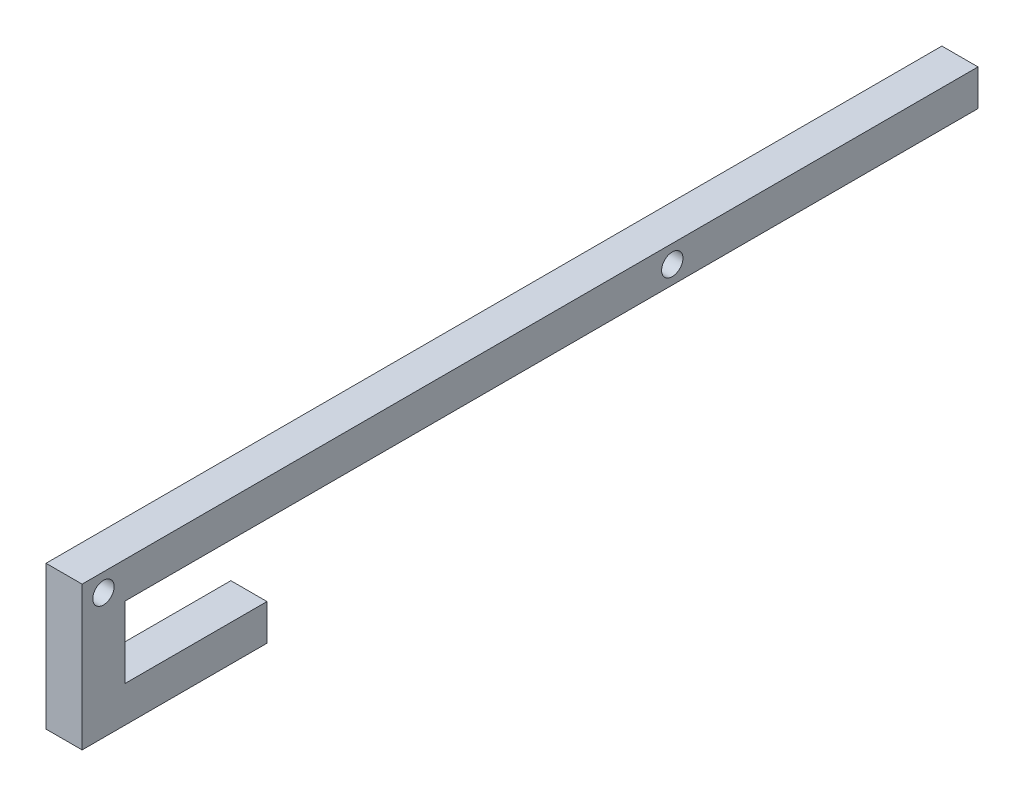
ISO-10303-21;
HEADER;
FILE_DESCRIPTION(('STEP AP214'),'2;1');
FILE_NAME('part.step','',(''),(''),'','','');
FILE_SCHEMA(('AUTOMOTIVE_DESIGN { 1 0 10303 214 1 1 1 1 }'));
ENDSEC;
DATA;
#1=APPLICATION_CONTEXT('core data for automotive mechanical design processes');
#2=APPLICATION_PROTOCOL_DEFINITION('international standard','automotive_design',2000,#1);
#3=PRODUCT_CONTEXT('',#1,'mechanical');
#4=PRODUCT('Part','Part','',(#3));
#5=PRODUCT_RELATED_PRODUCT_CATEGORY('part','',(#4));
#6=PRODUCT_DEFINITION_FORMATION('','',#4);
#7=PRODUCT_DEFINITION_CONTEXT('part definition',#1,'design');
#8=PRODUCT_DEFINITION('design','',#6,#7);
#9=PRODUCT_DEFINITION_SHAPE('','',#8);
#10=(LENGTH_UNIT() NAMED_UNIT(*) SI_UNIT(.MILLI.,.METRE.));
#11=(NAMED_UNIT(*) PLANE_ANGLE_UNIT() SI_UNIT($,.RADIAN.));
#12=(NAMED_UNIT(*) SI_UNIT($,.STERADIAN.) SOLID_ANGLE_UNIT());
#13=UNCERTAINTY_MEASURE_WITH_UNIT(LENGTH_MEASURE(1.E-05),#10,'distance_accuracy_value','');
#14=(GEOMETRIC_REPRESENTATION_CONTEXT(3) GLOBAL_UNCERTAINTY_ASSIGNED_CONTEXT((#13)) GLOBAL_UNIT_ASSIGNED_CONTEXT((#10,
#11,#12)) REPRESENTATION_CONTEXT('',''));
#15=CARTESIAN_POINT('',(0.,0.,0.));
#16=DIRECTION('',(0.,0.,1.));
#17=DIRECTION('',(1.,0.,0.));
#18=AXIS2_PLACEMENT_3D('',#15,#16,#17);
#19=CARTESIAN_POINT('',(12.7,0.,0.));
#20=DIRECTION('',(0.,1.,0.));
#21=DIRECTION('',(0.,0.,1.));
#22=AXIS2_PLACEMENT_3D('',#19,#20,#21);
#23=PLANE('',#22);
#24=DIRECTION('',(0.,0.,-1.));
#25=VECTOR('',#24,1.);
#26=CARTESIAN_POINT('',(0.,0.,0.));
#27=LINE('',#26,#25);
#28=CARTESIAN_POINT('',(0.,0.,-15.));
#29=VERTEX_POINT('',#28);
#30=CARTESIAN_POINT('',(0.,0.,-315.));
#31=VERTEX_POINT('',#30);
#32=EDGE_CURVE('E144',#29,#31,#27,.T.);
#33=ORIENTED_EDGE('',*,*,#32,.T.);
#34=DIRECTION('',(-1.,0.,0.));
#35=VECTOR('',#34,1.);
#36=CARTESIAN_POINT('',(12.7,0.,-315.));
#37=LINE('',#36,#35);
#38=CARTESIAN_POINT('',(12.7,0.,-315.));
#39=VERTEX_POINT('',#38);
#40=EDGE_CURVE('E11',#39,#31,#37,.T.);
#41=ORIENTED_EDGE('',*,*,#40,.F.);
#42=DIRECTION('',(0.,0.,-1.));
#43=VECTOR('',#42,1.);
#44=CARTESIAN_POINT('',(12.7,0.,0.));
#45=LINE('',#44,#43);
#46=CARTESIAN_POINT('',(12.7,0.,-15.));
#47=VERTEX_POINT('',#46);
#48=EDGE_CURVE('E172',#47,#39,#45,.T.);
#49=ORIENTED_EDGE('',*,*,#48,.F.);
#50=DIRECTION('',(-1.,0.,0.));
#51=VECTOR('',#50,1.);
#52=CARTESIAN_POINT('',(12.7,0.,-15.));
#53=LINE('',#52,#51);
#54=EDGE_CURVE('E58',#47,#29,#53,.T.);
#55=ORIENTED_EDGE('',*,*,#54,.T.);
#56=EDGE_LOOP('',(#33,#41,#49,#55));
#57=FACE_BOUND('',#56,.T.);
#58=ADVANCED_FACE('F41',(#57),#23,.F.);
#59=CARTESIAN_POINT('',(12.7,0.,-315.));
#60=DIRECTION('',(0.,0.,1.));
#61=DIRECTION('',(1.,0.,0.));
#62=AXIS2_PLACEMENT_3D('',#59,#60,#61);
#63=PLANE('',#62);
#64=DIRECTION('',(0.,1.,0.));
#65=VECTOR('',#64,1.);
#66=CARTESIAN_POINT('',(0.,0.,-315.));
#67=LINE('',#66,#65);
#68=CARTESIAN_POINT('',(0.,12.7000000000001,-315.));
#69=VERTEX_POINT('',#68);
#70=EDGE_CURVE('E147',#31,#69,#67,.T.);
#71=ORIENTED_EDGE('',*,*,#70,.T.);
#72=DIRECTION('',(-1.,0.,0.));
#73=VECTOR('',#72,1.);
#74=CARTESIAN_POINT('',(12.7,12.7000000000001,-315.));
#75=LINE('',#74,#73);
#76=CARTESIAN_POINT('',(12.7,12.7000000000001,-315.));
#77=VERTEX_POINT('',#76);
#78=EDGE_CURVE('E50',#77,#69,#75,.T.);
#79=ORIENTED_EDGE('',*,*,#78,.F.);
#80=DIRECTION('',(0.,1.,0.));
#81=VECTOR('',#80,1.);
#82=CARTESIAN_POINT('',(12.7,0.,-315.));
#83=LINE('',#82,#81);
#84=EDGE_CURVE('E96',#39,#77,#83,.T.);
#85=ORIENTED_EDGE('',*,*,#84,.F.);
#86=ORIENTED_EDGE('',*,*,#40,.T.);
#87=EDGE_LOOP('',(#71,#79,#85,#86));
#88=FACE_BOUND('',#87,.T.);
#89=ADVANCED_FACE('F191',(#88),#63,.F.);
#90=CARTESIAN_POINT('',(12.7,12.7,0.));
#91=DIRECTION('',(0.,1.,0.));
#92=DIRECTION('',(0.,0.,1.));
#93=AXIS2_PLACEMENT_3D('',#90,#91,#92);
#94=PLANE('',#93);
#95=DIRECTION('',(0.,0.,-1.));
#96=VECTOR('',#95,1.);
#97=CARTESIAN_POINT('',(0.,12.7,0.));
#98=LINE('',#97,#96);
#99=CARTESIAN_POINT('',(0.,12.7,0.));
#100=VERTEX_POINT('',#99);
#101=EDGE_CURVE('E152',#100,#69,#98,.T.);
#102=ORIENTED_EDGE('',*,*,#101,.F.);
#103=DIRECTION('',(-1.,0.,0.));
#104=VECTOR('',#103,1.);
#105=CARTESIAN_POINT('',(12.7,12.7,0.));
#106=LINE('',#105,#104);
#107=CARTESIAN_POINT('',(12.7,12.7,0.));
#108=VERTEX_POINT('',#107);
#109=EDGE_CURVE('E182',#108,#100,#106,.T.);
#110=ORIENTED_EDGE('',*,*,#109,.F.);
#111=DIRECTION('',(0.,0.,-1.));
#112=VECTOR('',#111,1.);
#113=CARTESIAN_POINT('',(12.7,12.7,0.));
#114=LINE('',#113,#112);
#115=EDGE_CURVE('E190',#108,#77,#114,.T.);
#116=ORIENTED_EDGE('',*,*,#115,.T.);
#117=ORIENTED_EDGE('',*,*,#78,.T.);
#118=EDGE_LOOP('',(#102,#110,#116,#117));
#119=FACE_BOUND('',#118,.T.);
#120=ADVANCED_FACE('F188',(#119),#94,.T.);
#121=CARTESIAN_POINT('',(12.7,0.,0.));
#122=DIRECTION('',(0.,0.,1.));
#123=DIRECTION('',(1.,0.,0.));
#124=AXIS2_PLACEMENT_3D('',#121,#122,#123);
#125=PLANE('',#124);
#126=DIRECTION('',(0.,1.,0.));
#127=VECTOR('',#126,1.);
#128=CARTESIAN_POINT('',(0.,0.,0.));
#129=LINE('',#128,#127);
#130=CARTESIAN_POINT('',(0.,-37.8,0.));
#131=VERTEX_POINT('',#130);
#132=EDGE_CURVE('E156',#131,#100,#129,.T.);
#133=ORIENTED_EDGE('',*,*,#132,.F.);
#134=DIRECTION('',(-1.,0.,0.));
#135=VECTOR('',#134,1.);
#136=CARTESIAN_POINT('',(12.7,-37.8,0.));
#137=LINE('',#136,#135);
#138=CARTESIAN_POINT('',(12.7,-37.8,0.));
#139=VERTEX_POINT('',#138);
#140=EDGE_CURVE('E179',#139,#131,#137,.T.);
#141=ORIENTED_EDGE('',*,*,#140,.F.);
#142=DIRECTION('',(0.,1.,0.));
#143=VECTOR('',#142,1.);
#144=CARTESIAN_POINT('',(12.7,0.,0.));
#145=LINE('',#144,#143);
#146=EDGE_CURVE('E200',#139,#108,#145,.T.);
#147=ORIENTED_EDGE('',*,*,#146,.T.);
#148=ORIENTED_EDGE('',*,*,#109,.T.);
#149=EDGE_LOOP('',(#133,#141,#147,#148));
#150=FACE_BOUND('',#149,.T.);
#151=ADVANCED_FACE('F198',(#150),#125,.T.);
#152=CARTESIAN_POINT('',(12.7,-37.8,0.));
#153=DIRECTION('',(0.,1.,0.));
#154=DIRECTION('',(0.,0.,1.));
#155=AXIS2_PLACEMENT_3D('',#152,#153,#154);
#156=PLANE('',#155);
#157=DIRECTION('',(0.,0.,-1.));
#158=VECTOR('',#157,1.);
#159=CARTESIAN_POINT('',(0.,-37.8,0.));
#160=LINE('',#159,#158);
#161=CARTESIAN_POINT('',(0.,-37.8,-65.));
#162=VERTEX_POINT('',#161);
#163=EDGE_CURVE('E160',#131,#162,#160,.T.);
#164=ORIENTED_EDGE('',*,*,#163,.T.);
#165=DIRECTION('',(-1.,0.,0.));
#166=VECTOR('',#165,1.);
#167=CARTESIAN_POINT('',(12.7,-37.8,-65.));
#168=LINE('',#167,#166);
#169=CARTESIAN_POINT('',(12.7,-37.8,-65.));
#170=VERTEX_POINT('',#169);
#171=EDGE_CURVE('E134',#170,#162,#168,.T.);
#172=ORIENTED_EDGE('',*,*,#171,.F.);
#173=DIRECTION('',(0.,0.,-1.));
#174=VECTOR('',#173,1.);
#175=CARTESIAN_POINT('',(12.7,-37.8,0.));
#176=LINE('',#175,#174);
#177=EDGE_CURVE('E120',#139,#170,#176,.T.);
#178=ORIENTED_EDGE('',*,*,#177,.F.);
#179=ORIENTED_EDGE('',*,*,#140,.T.);
#180=EDGE_LOOP('',(#164,#172,#178,#179));
#181=FACE_BOUND('',#180,.T.);
#182=ADVANCED_FACE('F263',(#181),#156,.F.);
#183=CARTESIAN_POINT('',(12.7,0.,-65.));
#184=DIRECTION('',(0.,0.,1.));
#185=DIRECTION('',(1.,0.,0.));
#186=AXIS2_PLACEMENT_3D('',#183,#184,#185);
#187=PLANE('',#186);
#188=DIRECTION('',(0.,1.,0.));
#189=VECTOR('',#188,1.);
#190=CARTESIAN_POINT('',(0.,0.,-65.));
#191=LINE('',#190,#189);
#192=CARTESIAN_POINT('',(0.,-25.1,-65.));
#193=VERTEX_POINT('',#192);
#194=EDGE_CURVE('E130',#162,#193,#191,.T.);
#195=ORIENTED_EDGE('',*,*,#194,.T.);
#196=DIRECTION('',(-1.,0.,0.));
#197=VECTOR('',#196,1.);
#198=CARTESIAN_POINT('',(12.7,-25.1,-65.));
#199=LINE('',#198,#197);
#200=CARTESIAN_POINT('',(12.7,-25.1,-65.));
#201=VERTEX_POINT('',#200);
#202=EDGE_CURVE('E127',#201,#193,#199,.T.);
#203=ORIENTED_EDGE('',*,*,#202,.F.);
#204=DIRECTION('',(0.,1.,0.));
#205=VECTOR('',#204,1.);
#206=CARTESIAN_POINT('',(12.7,0.,-65.));
#207=LINE('',#206,#205);
#208=EDGE_CURVE('E112',#170,#201,#207,.T.);
#209=ORIENTED_EDGE('',*,*,#208,.F.);
#210=ORIENTED_EDGE('',*,*,#171,.T.);
#211=EDGE_LOOP('',(#195,#203,#209,#210));
#212=FACE_BOUND('',#211,.T.);
#213=ADVANCED_FACE('F128',(#212),#187,.F.);
#214=CARTESIAN_POINT('',(12.7,-25.1,0.));
#215=DIRECTION('',(0.,1.,0.));
#216=DIRECTION('',(0.,0.,1.));
#217=AXIS2_PLACEMENT_3D('',#214,#215,#216);
#218=PLANE('',#217);
#219=DIRECTION('',(0.,0.,-1.));
#220=VECTOR('',#219,1.);
#221=CARTESIAN_POINT('',(0.,-25.1,0.));
#222=LINE('',#221,#220);
#223=CARTESIAN_POINT('',(0.,-25.1,-15.));
#224=VERTEX_POINT('',#223);
#225=EDGE_CURVE('E165',#224,#193,#222,.T.);
#226=ORIENTED_EDGE('',*,*,#225,.F.);
#227=DIRECTION('',(-1.,0.,0.));
#228=VECTOR('',#227,1.);
#229=CARTESIAN_POINT('',(12.7,-25.1,-15.));
#230=LINE('',#229,#228);
#231=CARTESIAN_POINT('',(12.7,-25.1,-15.));
#232=VERTEX_POINT('',#231);
#233=EDGE_CURVE('E84',#232,#224,#230,.T.);
#234=ORIENTED_EDGE('',*,*,#233,.F.);
#235=DIRECTION('',(0.,0.,-1.));
#236=VECTOR('',#235,1.);
#237=CARTESIAN_POINT('',(12.7,-25.1,0.));
#238=LINE('',#237,#236);
#239=EDGE_CURVE('E117',#232,#201,#238,.T.);
#240=ORIENTED_EDGE('',*,*,#239,.T.);
#241=ORIENTED_EDGE('',*,*,#202,.T.);
#242=EDGE_LOOP('',(#226,#234,#240,#241));
#243=FACE_BOUND('',#242,.T.);
#244=ADVANCED_FACE('F136',(#243),#218,.T.);
#245=CARTESIAN_POINT('',(12.7,0.,-15.));
#246=DIRECTION('',(0.,0.,-1.));
#247=DIRECTION('',(0.,1.,0.));
#248=AXIS2_PLACEMENT_3D('',#245,#246,#247);
#249=PLANE('',#248);
#250=DIRECTION('',(0.,-1.,0.));
#251=VECTOR('',#250,1.);
#252=CARTESIAN_POINT('',(0.,0.,-15.));
#253=LINE('',#252,#251);
#254=EDGE_CURVE('E168',#29,#224,#253,.T.);
#255=ORIENTED_EDGE('',*,*,#254,.F.);
#256=ORIENTED_EDGE('',*,*,#54,.F.);
#257=DIRECTION('',(0.,-1.,0.));
#258=VECTOR('',#257,1.);
#259=CARTESIAN_POINT('',(12.7,0.,-15.));
#260=LINE('',#259,#258);
#261=EDGE_CURVE('E138',#47,#232,#260,.T.);
#262=ORIENTED_EDGE('',*,*,#261,.T.);
#263=ORIENTED_EDGE('',*,*,#233,.T.);
#264=EDGE_LOOP('',(#255,#256,#262,#263));
#265=FACE_BOUND('',#264,.T.);
#266=ADVANCED_FACE('F238',(#265),#249,.T.);
#267=CARTESIAN_POINT('',(12.7,0.,0.));
#268=DIRECTION('',(1.,0.,0.));
#269=DIRECTION('',(0.,0.,-1.));
#270=AXIS2_PLACEMENT_3D('',#267,#268,#269);
#271=PLANE('',#270);
#272=CARTESIAN_POINT('',(12.7,6.35,-7.5));
#273=DIRECTION('',(1.,0.,0.));
#274=DIRECTION('',(0.,0.,-1.));
#275=AXIS2_PLACEMENT_3D('',#272,#273,#274);
#276=CIRCLE('',#275,3.75);
#277=CARTESIAN_POINT('',(12.7,6.35,-11.25));
#278=VERTEX_POINT('',#277);
#279=EDGE_CURVE('E219',#278,#278,#276,.T.);
#280=ORIENTED_EDGE('',*,*,#279,.F.);
#281=EDGE_LOOP('',(#280));
#282=FACE_BOUND('',#281,.T.);
#283=CARTESIAN_POINT('',(12.7,6.35,-207.5));
#284=DIRECTION('',(1.,0.,0.));
#285=DIRECTION('',(0.,0.,-1.));
#286=AXIS2_PLACEMENT_3D('',#283,#284,#285);
#287=CIRCLE('',#286,3.75000000000001);
#288=CARTESIAN_POINT('',(12.7,6.35,-211.25));
#289=VERTEX_POINT('',#288);
#290=EDGE_CURVE('E211',#289,#289,#287,.T.);
#291=ORIENTED_EDGE('',*,*,#290,.F.);
#292=EDGE_LOOP('',(#291));
#293=FACE_BOUND('',#292,.T.);
#294=ORIENTED_EDGE('',*,*,#48,.T.);
#295=ORIENTED_EDGE('',*,*,#84,.T.);
#296=ORIENTED_EDGE('',*,*,#115,.F.);
#297=ORIENTED_EDGE('',*,*,#146,.F.);
#298=ORIENTED_EDGE('',*,*,#177,.T.);
#299=ORIENTED_EDGE('',*,*,#208,.T.);
#300=ORIENTED_EDGE('',*,*,#239,.F.);
#301=ORIENTED_EDGE('',*,*,#261,.F.);
#302=EDGE_LOOP('',(#294,#295,#296,#297,#298,#299,#300,#301));
#303=FACE_BOUND('',#302,.T.);
#304=ADVANCED_FACE('F114',(#282,#293,#303),#271,.T.);
#305=CARTESIAN_POINT('',(0.,0.,0.));
#306=DIRECTION('',(1.,0.,0.));
#307=DIRECTION('',(0.,0.,-1.));
#308=AXIS2_PLACEMENT_3D('',#305,#306,#307);
#309=PLANE('',#308);
#310=CARTESIAN_POINT('',(0.,6.35,-7.5));
#311=DIRECTION('',(1.,0.,0.));
#312=DIRECTION('',(0.,0.,-1.));
#313=AXIS2_PLACEMENT_3D('',#310,#311,#312);
#314=CIRCLE('',#313,3.75);
#315=CARTESIAN_POINT('',(0.,6.35,-11.25));
#316=VERTEX_POINT('',#315);
#317=EDGE_CURVE('E148',#316,#316,#314,.T.);
#318=ORIENTED_EDGE('',*,*,#317,.T.);
#319=EDGE_LOOP('',(#318));
#320=FACE_BOUND('',#319,.T.);
#321=CARTESIAN_POINT('',(0.,6.35,-207.5));
#322=DIRECTION('',(1.,0.,0.));
#323=DIRECTION('',(0.,0.,-1.));
#324=AXIS2_PLACEMENT_3D('',#321,#322,#323);
#325=CIRCLE('',#324,3.75000000000001);
#326=CARTESIAN_POINT('',(0.,6.35,-211.25));
#327=VERTEX_POINT('',#326);
#328=EDGE_CURVE('E215',#327,#327,#325,.T.);
#329=ORIENTED_EDGE('',*,*,#328,.T.);
#330=EDGE_LOOP('',(#329));
#331=FACE_BOUND('',#330,.T.);
#332=ORIENTED_EDGE('',*,*,#32,.F.);
#333=ORIENTED_EDGE('',*,*,#254,.T.);
#334=ORIENTED_EDGE('',*,*,#225,.T.);
#335=ORIENTED_EDGE('',*,*,#194,.F.);
#336=ORIENTED_EDGE('',*,*,#163,.F.);
#337=ORIENTED_EDGE('',*,*,#132,.T.);
#338=ORIENTED_EDGE('',*,*,#101,.T.);
#339=ORIENTED_EDGE('',*,*,#70,.F.);
#340=EDGE_LOOP('',(#332,#333,#334,#335,#336,#337,#338,#339));
#341=FACE_BOUND('',#340,.T.);
#342=ADVANCED_FACE('F194',(#320,#331,#341),#309,.F.);
#343=CARTESIAN_POINT('',(0.,6.35,-207.5));
#344=DIRECTION('',(1.,0.,0.));
#345=DIRECTION('',(0.,0.,-1.));
#346=AXIS2_PLACEMENT_3D('',#343,#344,#345);
#347=CYLINDRICAL_SURFACE('',#346,3.75000000000001);
#348=ORIENTED_EDGE('',*,*,#328,.F.);
#349=EDGE_LOOP('',(#348));
#350=FACE_BOUND('',#349,.T.);
#351=ORIENTED_EDGE('',*,*,#290,.T.);
#352=EDGE_LOOP('',(#351));
#353=FACE_BOUND('',#352,.T.);
#354=ADVANCED_FACE('F232',(#350,#353),#347,.F.);
#355=CARTESIAN_POINT('',(0.,6.35,-7.5));
#356=DIRECTION('',(1.,0.,0.));
#357=DIRECTION('',(0.,0.,-1.));
#358=AXIS2_PLACEMENT_3D('',#355,#356,#357);
#359=CYLINDRICAL_SURFACE('',#358,3.75);
#360=ORIENTED_EDGE('',*,*,#317,.F.);
#361=EDGE_LOOP('',(#360));
#362=FACE_BOUND('',#361,.T.);
#363=ORIENTED_EDGE('',*,*,#279,.T.);
#364=EDGE_LOOP('',(#363));
#365=FACE_BOUND('',#364,.T.);
#366=ADVANCED_FACE('F229',(#362,#365),#359,.F.);
#367=CLOSED_SHELL('',(#58,#89,#120,#151,#182,#213,#244,#266,#304,#342,#354,#366));
#368=MANIFOLD_SOLID_BREP('B2',#367);
#369=ADVANCED_BREP_SHAPE_REPRESENTATION('',(#18,#368),#14);
#370=SHAPE_DEFINITION_REPRESENTATION(#9,#369);
ENDSEC;
END-ISO-10303-21;
